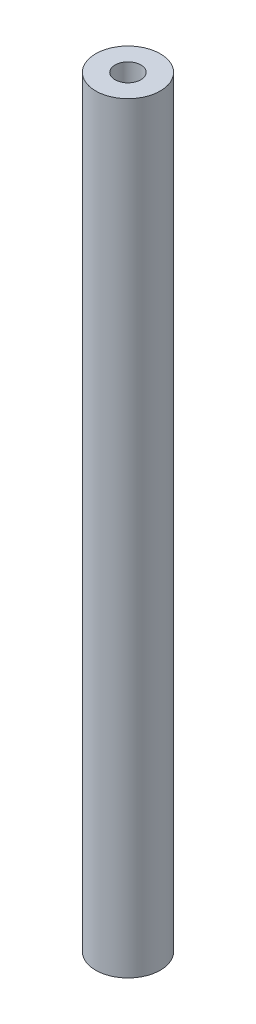
ISO-10303-21;
HEADER;
FILE_DESCRIPTION(('STEP AP214'),'2;1');
FILE_NAME('part.step','',(''),(''),'','','');
FILE_SCHEMA(('AUTOMOTIVE_DESIGN { 1 0 10303 214 1 1 1 1 }'));
ENDSEC;
DATA;
#1=APPLICATION_CONTEXT('core data for automotive mechanical design processes');
#2=APPLICATION_PROTOCOL_DEFINITION('international standard','automotive_design',2000,#1);
#3=PRODUCT_CONTEXT('',#1,'mechanical');
#4=PRODUCT('Part','Part','',(#3));
#5=PRODUCT_RELATED_PRODUCT_CATEGORY('part','',(#4));
#6=PRODUCT_DEFINITION_FORMATION('','',#4);
#7=PRODUCT_DEFINITION_CONTEXT('part definition',#1,'design');
#8=PRODUCT_DEFINITION('design','',#6,#7);
#9=PRODUCT_DEFINITION_SHAPE('','',#8);
#10=(LENGTH_UNIT() NAMED_UNIT(*) SI_UNIT(.MILLI.,.METRE.));
#11=(NAMED_UNIT(*) PLANE_ANGLE_UNIT() SI_UNIT($,.RADIAN.));
#12=(NAMED_UNIT(*) SI_UNIT($,.STERADIAN.) SOLID_ANGLE_UNIT());
#13=UNCERTAINTY_MEASURE_WITH_UNIT(LENGTH_MEASURE(1.E-05),#10,'distance_accuracy_value','');
#14=(GEOMETRIC_REPRESENTATION_CONTEXT(3) GLOBAL_UNCERTAINTY_ASSIGNED_CONTEXT((#13)) GLOBAL_UNIT_ASSIGNED_CONTEXT((#10,
#11,#12)) REPRESENTATION_CONTEXT('',''));
#15=CARTESIAN_POINT('',(0.,0.,0.));
#16=DIRECTION('',(0.,0.,1.));
#17=DIRECTION('',(1.,0.,0.));
#18=AXIS2_PLACEMENT_3D('',#15,#16,#17);
#19=CARTESIAN_POINT('',(0.,236.,0.));
#20=DIRECTION('',(0.,1.,0.));
#21=DIRECTION('',(0.,0.,1.));
#22=AXIS2_PLACEMENT_3D('',#19,#20,#21);
#23=PLANE('',#22);
#24=CARTESIAN_POINT('',(0.,236.,0.));
#25=DIRECTION('',(0.,1.,0.));
#26=DIRECTION('',(0.,0.,1.));
#27=AXIS2_PLACEMENT_3D('',#24,#25,#26);
#28=CIRCLE('',#27,10.);
#29=CARTESIAN_POINT('',(0.,236.,10.));
#30=VERTEX_POINT('',#29);
#31=EDGE_CURVE('E12',#30,#30,#28,.T.);
#32=ORIENTED_EDGE('',*,*,#31,.T.);
#33=EDGE_LOOP('',(#32));
#34=FACE_BOUND('',#33,.T.);
#35=CARTESIAN_POINT('',(0.,236.,0.));
#36=DIRECTION('',(0.,1.,0.));
#37=DIRECTION('',(0.,0.,1.));
#38=AXIS2_PLACEMENT_3D('',#35,#36,#37);
#39=CIRCLE('',#38,4.);
#40=CARTESIAN_POINT('',(0.,236.,4.));
#41=VERTEX_POINT('',#40);
#42=EDGE_CURVE('E51',#41,#41,#39,.T.);
#43=ORIENTED_EDGE('',*,*,#42,.F.);
#44=EDGE_LOOP('',(#43));
#45=FACE_BOUND('',#44,.T.);
#46=ADVANCED_FACE('F40',(#34,#45),#23,.T.);
#47=CARTESIAN_POINT('',(0.,0.,0.));
#48=DIRECTION('',(0.,1.,0.));
#49=DIRECTION('',(0.,0.,1.));
#50=AXIS2_PLACEMENT_3D('',#47,#48,#49);
#51=PLANE('',#50);
#52=CARTESIAN_POINT('',(0.,0.,0.));
#53=DIRECTION('',(0.,1.,0.));
#54=DIRECTION('',(0.,0.,1.));
#55=AXIS2_PLACEMENT_3D('',#52,#53,#54);
#56=CIRCLE('',#55,10.);
#57=CARTESIAN_POINT('',(0.,0.,10.));
#58=VERTEX_POINT('',#57);
#59=EDGE_CURVE('E44',#58,#58,#56,.T.);
#60=ORIENTED_EDGE('',*,*,#59,.F.);
#61=EDGE_LOOP('',(#60));
#62=FACE_BOUND('',#61,.T.);
#63=CARTESIAN_POINT('',(0.,0.,0.));
#64=DIRECTION('',(0.,1.,0.));
#65=DIRECTION('',(0.,0.,1.));
#66=AXIS2_PLACEMENT_3D('',#63,#64,#65);
#67=CIRCLE('',#66,4.);
#68=CARTESIAN_POINT('',(0.,0.,4.));
#69=VERTEX_POINT('',#68);
#70=EDGE_CURVE('E53',#69,#69,#67,.T.);
#71=ORIENTED_EDGE('',*,*,#70,.T.);
#72=EDGE_LOOP('',(#71));
#73=FACE_BOUND('',#72,.T.);
#74=ADVANCED_FACE('F63',(#62,#73),#51,.F.);
#75=CARTESIAN_POINT('',(0.,236.,0.));
#76=DIRECTION('',(0.,-1.,0.));
#77=DIRECTION('',(0.,0.,-1.));
#78=AXIS2_PLACEMENT_3D('',#75,#76,#77);
#79=CYLINDRICAL_SURFACE('',#78,10.);
#80=ORIENTED_EDGE('',*,*,#31,.F.);
#81=EDGE_LOOP('',(#80));
#82=FACE_BOUND('',#81,.T.);
#83=ORIENTED_EDGE('',*,*,#59,.T.);
#84=EDGE_LOOP('',(#83));
#85=FACE_BOUND('',#84,.T.);
#86=ADVANCED_FACE('F42',(#82,#85),#79,.T.);
#87=CARTESIAN_POINT('',(0.,236.,0.));
#88=DIRECTION('',(0.,-1.,0.));
#89=DIRECTION('',(0.,0.,-1.));
#90=AXIS2_PLACEMENT_3D('',#87,#88,#89);
#91=CYLINDRICAL_SURFACE('',#90,4.);
#92=ORIENTED_EDGE('',*,*,#42,.T.);
#93=EDGE_LOOP('',(#92));
#94=FACE_BOUND('',#93,.T.);
#95=ORIENTED_EDGE('',*,*,#70,.F.);
#96=EDGE_LOOP('',(#95));
#97=FACE_BOUND('',#96,.T.);
#98=ADVANCED_FACE('F59',(#94,#97),#91,.F.);
#99=CLOSED_SHELL('',(#46,#74,#86,#98));
#100=MANIFOLD_SOLID_BREP('B2',#99);
#101=ADVANCED_BREP_SHAPE_REPRESENTATION('',(#18,#100),#14);
#102=SHAPE_DEFINITION_REPRESENTATION(#9,#101);
ENDSEC;
END-ISO-10303-21;
